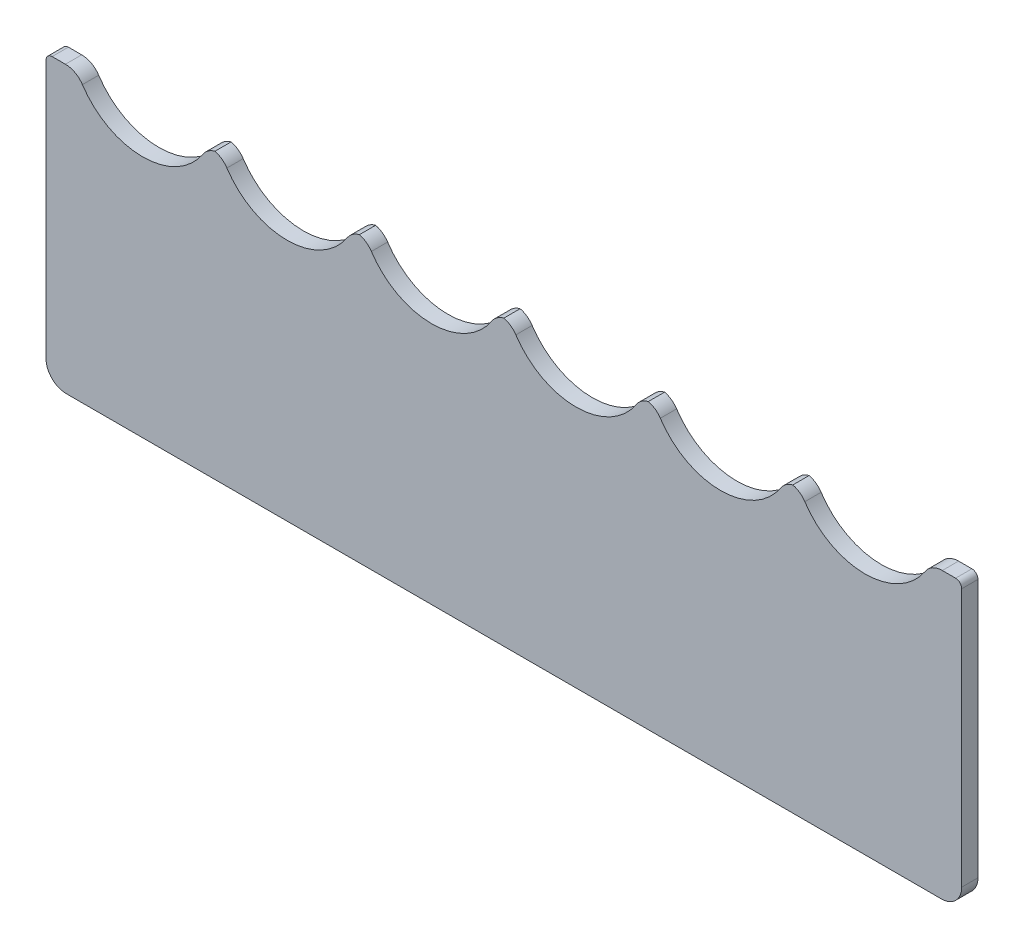
ISO-10303-21;
HEADER;
FILE_DESCRIPTION(('STEP AP214'),'2;1');
FILE_NAME('part.step','',(''),(''),'','','');
FILE_SCHEMA(('AUTOMOTIVE_DESIGN { 1 0 10303 214 1 1 1 1 }'));
ENDSEC;
DATA;
#1=APPLICATION_CONTEXT('core data for automotive mechanical design processes');
#2=APPLICATION_PROTOCOL_DEFINITION('international standard','automotive_design',2000,#1);
#3=PRODUCT_CONTEXT('',#1,'mechanical');
#4=PRODUCT('Part','Part','',(#3));
#5=PRODUCT_RELATED_PRODUCT_CATEGORY('part','',(#4));
#6=PRODUCT_DEFINITION_FORMATION('','',#4);
#7=PRODUCT_DEFINITION_CONTEXT('part definition',#1,'design');
#8=PRODUCT_DEFINITION('design','',#6,#7);
#9=PRODUCT_DEFINITION_SHAPE('','',#8);
#10=(LENGTH_UNIT() NAMED_UNIT(*) SI_UNIT(.MILLI.,.METRE.));
#11=(NAMED_UNIT(*) PLANE_ANGLE_UNIT() SI_UNIT($,.RADIAN.));
#12=(NAMED_UNIT(*) SI_UNIT($,.STERADIAN.) SOLID_ANGLE_UNIT());
#13=UNCERTAINTY_MEASURE_WITH_UNIT(LENGTH_MEASURE(1.E-05),#10,'distance_accuracy_value','');
#14=(GEOMETRIC_REPRESENTATION_CONTEXT(3) GLOBAL_UNCERTAINTY_ASSIGNED_CONTEXT((#13)) GLOBAL_UNIT_ASSIGNED_CONTEXT((#10,
#11,#12)) REPRESENTATION_CONTEXT('',''));
#15=CARTESIAN_POINT('',(0.,0.,0.));
#16=DIRECTION('',(0.,0.,1.));
#17=DIRECTION('',(1.,0.,0.));
#18=AXIS2_PLACEMENT_3D('',#15,#16,#17);
#19=CARTESIAN_POINT('',(0.,140.,8.));
#20=DIRECTION('',(0.,-1.,0.));
#21=DIRECTION('',(0.,0.,-1.));
#22=AXIS2_PLACEMENT_3D('',#19,#20,#21);
#23=PLANE('',#22);
#24=DIRECTION('',(-1.,0.,0.));
#25=VECTOR('',#24,1.);
#26=CARTESIAN_POINT('',(0.,140.,8.));
#27=LINE('',#26,#25);
#28=CARTESIAN_POINT('',(447.,140.,8.));
#29=VERTEX_POINT('',#28);
#30=CARTESIAN_POINT('',(440.456587043621,140.,8.));
#31=VERTEX_POINT('',#30);
#32=EDGE_CURVE('E234',#29,#31,#27,.T.);
#33=ORIENTED_EDGE('',*,*,#32,.F.);
#34=DIRECTION('',(0.,0.,-1.));
#35=VECTOR('',#34,1.);
#36=CARTESIAN_POINT('',(447.,140.,8.));
#37=LINE('',#36,#35);
#38=CARTESIAN_POINT('',(447.,140.,0.));
#39=VERTEX_POINT('',#38);
#40=EDGE_CURVE('E344',#29,#39,#37,.T.);
#41=ORIENTED_EDGE('',*,*,#40,.T.);
#42=DIRECTION('',(-1.,0.,0.));
#43=VECTOR('',#42,1.);
#44=CARTESIAN_POINT('',(0.,140.,0.));
#45=LINE('',#44,#43);
#46=CARTESIAN_POINT('',(440.456587043621,140.,0.));
#47=VERTEX_POINT('',#46);
#48=EDGE_CURVE('E242',#39,#47,#45,.T.);
#49=ORIENTED_EDGE('',*,*,#48,.T.);
#50=DIRECTION('',(0.,0.,1.));
#51=VECTOR('',#50,1.);
#52=CARTESIAN_POINT('',(440.456587043621,140.,8.));
#53=LINE('',#52,#51);
#54=EDGE_CURVE('E316',#47,#31,#53,.T.);
#55=ORIENTED_EDGE('',*,*,#54,.T.);
#56=EDGE_LOOP('',(#33,#41,#49,#55));
#57=FACE_BOUND('',#56,.T.);
#58=ADVANCED_FACE('F33',(#57),#23,.F.);
#59=CARTESIAN_POINT('',(0.,0.,8.));
#60=DIRECTION('',(1.,0.,0.));
#61=DIRECTION('',(0.,0.,-1.));
#62=AXIS2_PLACEMENT_3D('',#59,#60,#61);
#63=PLANE('',#62);
#64=DIRECTION('',(0.,-1.,0.));
#65=VECTOR('',#64,1.);
#66=CARTESIAN_POINT('',(0.,0.,8.));
#67=LINE('',#66,#65);
#68=CARTESIAN_POINT('',(0.,137.,8.));
#69=VERTEX_POINT('',#68);
#70=CARTESIAN_POINT('',(0.,10.,8.));
#71=VERTEX_POINT('',#70);
#72=EDGE_CURVE('E247',#69,#71,#67,.T.);
#73=ORIENTED_EDGE('',*,*,#72,.F.);
#74=DIRECTION('',(0.,0.,-1.));
#75=VECTOR('',#74,1.);
#76=CARTESIAN_POINT('',(0.,137.,8.));
#77=LINE('',#76,#75);
#78=CARTESIAN_POINT('',(0.,137.,0.));
#79=VERTEX_POINT('',#78);
#80=EDGE_CURVE('E41',#69,#79,#77,.T.);
#81=ORIENTED_EDGE('',*,*,#80,.T.);
#82=DIRECTION('',(0.,-1.,0.));
#83=VECTOR('',#82,1.);
#84=CARTESIAN_POINT('',(0.,0.,0.));
#85=LINE('',#84,#83);
#86=CARTESIAN_POINT('',(0.,10.,0.));
#87=VERTEX_POINT('',#86);
#88=EDGE_CURVE('E244',#79,#87,#85,.T.);
#89=ORIENTED_EDGE('',*,*,#88,.T.);
#90=DIRECTION('',(0.,0.,-1.));
#91=VECTOR('',#90,1.);
#92=CARTESIAN_POINT('',(0.,10.,8.));
#93=LINE('',#92,#91);
#94=EDGE_CURVE('E306',#87,#71,#93,.F.);
#95=ORIENTED_EDGE('',*,*,#94,.T.);
#96=EDGE_LOOP('',(#73,#81,#89,#95));
#97=FACE_BOUND('',#96,.T.);
#98=ADVANCED_FACE('F374',(#97),#63,.F.);
#99=CARTESIAN_POINT('',(0.,0.,8.));
#100=DIRECTION('',(0.,1.,0.));
#101=DIRECTION('',(0.,0.,1.));
#102=AXIS2_PLACEMENT_3D('',#99,#100,#101);
#103=PLANE('',#102);
#104=DIRECTION('',(1.,0.,0.));
#105=VECTOR('',#104,1.);
#106=CARTESIAN_POINT('',(0.,0.,0.));
#107=LINE('',#106,#105);
#108=CARTESIAN_POINT('',(10.,0.,0.));
#109=VERTEX_POINT('',#108);
#110=CARTESIAN_POINT('',(440.,0.,0.));
#111=VERTEX_POINT('',#110);
#112=EDGE_CURVE('E240',#109,#111,#107,.T.);
#113=ORIENTED_EDGE('',*,*,#112,.T.);
#114=DIRECTION('',(0.,0.,-1.));
#115=VECTOR('',#114,1.);
#116=CARTESIAN_POINT('',(440.,0.,8.));
#117=LINE('',#116,#115);
#118=CARTESIAN_POINT('',(440.,0.,8.));
#119=VERTEX_POINT('',#118);
#120=EDGE_CURVE('E217',#111,#119,#117,.F.);
#121=ORIENTED_EDGE('',*,*,#120,.T.);
#122=DIRECTION('',(1.,0.,0.));
#123=VECTOR('',#122,1.);
#124=CARTESIAN_POINT('',(0.,0.,8.));
#125=LINE('',#124,#123);
#126=CARTESIAN_POINT('',(10.,0.,8.));
#127=VERTEX_POINT('',#126);
#128=EDGE_CURVE('E386',#127,#119,#125,.T.);
#129=ORIENTED_EDGE('',*,*,#128,.F.);
#130=DIRECTION('',(0.,0.,-1.));
#131=VECTOR('',#130,1.);
#132=CARTESIAN_POINT('',(10.,0.,8.));
#133=LINE('',#132,#131);
#134=EDGE_CURVE('E222',#127,#109,#133,.T.);
#135=ORIENTED_EDGE('',*,*,#134,.T.);
#136=EDGE_LOOP('',(#113,#121,#129,#135));
#137=FACE_BOUND('',#136,.T.);
#138=ADVANCED_FACE('F497',(#137),#103,.F.);
#139=CARTESIAN_POINT('',(450.,0.,8.));
#140=DIRECTION('',(-1.,0.,0.));
#141=DIRECTION('',(0.,0.,1.));
#142=AXIS2_PLACEMENT_3D('',#139,#140,#141);
#143=PLANE('',#142);
#144=DIRECTION('',(0.,1.,0.));
#145=VECTOR('',#144,1.);
#146=CARTESIAN_POINT('',(450.,0.,0.));
#147=LINE('',#146,#145);
#148=CARTESIAN_POINT('',(450.,10.,0.));
#149=VERTEX_POINT('',#148);
#150=CARTESIAN_POINT('',(450.,137.,0.));
#151=VERTEX_POINT('',#150);
#152=EDGE_CURVE('E229',#149,#151,#147,.T.);
#153=ORIENTED_EDGE('',*,*,#152,.T.);
#154=DIRECTION('',(0.,0.,-1.));
#155=VECTOR('',#154,1.);
#156=CARTESIAN_POINT('',(450.,137.,8.));
#157=LINE('',#156,#155);
#158=CARTESIAN_POINT('',(450.,137.,8.));
#159=VERTEX_POINT('',#158);
#160=EDGE_CURVE('E366',#151,#159,#157,.F.);
#161=ORIENTED_EDGE('',*,*,#160,.T.);
#162=DIRECTION('',(0.,1.,0.));
#163=VECTOR('',#162,1.);
#164=CARTESIAN_POINT('',(450.,0.,8.));
#165=LINE('',#164,#163);
#166=CARTESIAN_POINT('',(450.,10.,8.));
#167=VERTEX_POINT('',#166);
#168=EDGE_CURVE('E232',#167,#159,#165,.T.);
#169=ORIENTED_EDGE('',*,*,#168,.F.);
#170=DIRECTION('',(0.,0.,-1.));
#171=VECTOR('',#170,1.);
#172=CARTESIAN_POINT('',(450.,10.,8.));
#173=LINE('',#172,#171);
#174=EDGE_CURVE('E216',#167,#149,#173,.T.);
#175=ORIENTED_EDGE('',*,*,#174,.T.);
#176=EDGE_LOOP('',(#153,#161,#169,#175));
#177=FACE_BOUND('',#176,.T.);
#178=ADVANCED_FACE('F228',(#177),#143,.F.);
#179=CARTESIAN_POINT('',(9.54341295637873,140.,0.));
#180=VERTEX_POINT('',#179);
#181=CARTESIAN_POINT('',(3.,140.,0.));
#182=VERTEX_POINT('',#181);
#183=EDGE_CURVE('E239',#180,#182,#45,.T.);
#184=ORIENTED_EDGE('',*,*,#183,.T.);
#185=DIRECTION('',(0.,0.,-1.));
#186=VECTOR('',#185,1.);
#187=CARTESIAN_POINT('',(3.,140.,8.));
#188=LINE('',#187,#186);
#189=CARTESIAN_POINT('',(3.,140.,8.));
#190=VERTEX_POINT('',#189);
#191=EDGE_CURVE('E11',#182,#190,#188,.F.);
#192=ORIENTED_EDGE('',*,*,#191,.T.);
#193=CARTESIAN_POINT('',(9.54341295637873,140.,8.));
#194=VERTEX_POINT('',#193);
#195=EDGE_CURVE('E384',#194,#190,#27,.T.);
#196=ORIENTED_EDGE('',*,*,#195,.F.);
#197=DIRECTION('',(0.,0.,1.));
#198=VECTOR('',#197,1.);
#199=CARTESIAN_POINT('',(9.54341295637873,140.,8.));
#200=LINE('',#199,#198);
#201=EDGE_CURVE('E309',#194,#180,#200,.F.);
#202=ORIENTED_EDGE('',*,*,#201,.T.);
#203=EDGE_LOOP('',(#184,#192,#196,#202));
#204=FACE_BOUND('',#203,.T.);
#205=ADVANCED_FACE('F513',(#204),#23,.F.);
#206=CARTESIAN_POINT('',(0.,0.,8.));
#207=DIRECTION('',(0.,0.,-1.));
#208=DIRECTION('',(-1.,0.,0.));
#209=AXIS2_PLACEMENT_3D('',#206,#207,#208);
#210=PLANE('',#209);
#211=ORIENTED_EDGE('',*,*,#168,.T.);
#212=CARTESIAN_POINT('',(447.,137.,8.));
#213=DIRECTION('',(0.,0.,-1.));
#214=DIRECTION('',(-1.,0.,0.));
#215=AXIS2_PLACEMENT_3D('',#212,#213,#214);
#216=CIRCLE('',#215,3.);
#217=EDGE_CURVE('E369',#159,#29,#216,.F.);
#218=ORIENTED_EDGE('',*,*,#217,.T.);
#219=ORIENTED_EDGE('',*,*,#32,.T.);
#220=CARTESIAN_POINT('',(440.456587043621,130.,8.));
#221=DIRECTION('',(0.,0.,-1.));
#222=DIRECTION('',(-1.,0.,0.));
#223=AXIS2_PLACEMENT_3D('',#220,#221,#222);
#224=CIRCLE('',#223,10.);
#225=CARTESIAN_POINT('',(432.105302765597,135.500550055006,8.));
#226=VERTEX_POINT('',#225);
#227=EDGE_CURVE('E298',#31,#226,#224,.F.);
#228=ORIENTED_EDGE('',*,*,#227,.T.);
#229=CARTESIAN_POINT('',(402.5,155.,8.));
#230=DIRECTION('',(0.,0.,-1.));
#231=DIRECTION('',(-1.,0.,0.));
#232=AXIS2_PLACEMENT_3D('',#229,#230,#231);
#233=CIRCLE('',#232,35.45);
#234=CARTESIAN_POINT('',(372.894697234403,135.500550055006,8.));
#235=VERTEX_POINT('',#234);
#236=EDGE_CURVE('E398',#226,#235,#233,.T.);
#237=ORIENTED_EDGE('',*,*,#236,.T.);
#238=CARTESIAN_POINT('',(364.543412956379,130.,8.));
#239=DIRECTION('',(0.,0.,-1.));
#240=DIRECTION('',(-1.,0.,0.));
#241=AXIS2_PLACEMENT_3D('',#238,#239,#240);
#242=CIRCLE('',#241,10.);
#243=CARTESIAN_POINT('',(367.,139.693563849128,8.));
#244=VERTEX_POINT('',#243);
#245=EDGE_CURVE('E296',#235,#244,#242,.F.);
#246=ORIENTED_EDGE('',*,*,#245,.T.);
#247=CARTESIAN_POINT('',(369.456587043621,130.,8.));
#248=DIRECTION('',(0.,0.,-1.));
#249=DIRECTION('',(-1.,0.,0.));
#250=AXIS2_PLACEMENT_3D('',#247,#248,#249);
#251=CIRCLE('',#250,10.);
#252=CARTESIAN_POINT('',(361.105302765597,135.500550055006,8.));
#253=VERTEX_POINT('',#252);
#254=EDGE_CURVE('E294',#244,#253,#251,.F.);
#255=ORIENTED_EDGE('',*,*,#254,.T.);
#256=CARTESIAN_POINT('',(331.5,155.,8.));
#257=DIRECTION('',(0.,0.,-1.));
#258=DIRECTION('',(-1.,0.,0.));
#259=AXIS2_PLACEMENT_3D('',#256,#257,#258);
#260=CIRCLE('',#259,35.45);
#261=CARTESIAN_POINT('',(301.894697234403,135.500550055006,8.));
#262=VERTEX_POINT('',#261);
#263=EDGE_CURVE('E401',#253,#262,#260,.T.);
#264=ORIENTED_EDGE('',*,*,#263,.T.);
#265=CARTESIAN_POINT('',(293.543412956379,130.,8.));
#266=DIRECTION('',(0.,0.,-1.));
#267=DIRECTION('',(-1.,0.,0.));
#268=AXIS2_PLACEMENT_3D('',#265,#266,#267);
#269=CIRCLE('',#268,10.);
#270=CARTESIAN_POINT('',(296.,139.693563849128,8.));
#271=VERTEX_POINT('',#270);
#272=EDGE_CURVE('E292',#262,#271,#269,.F.);
#273=ORIENTED_EDGE('',*,*,#272,.T.);
#274=CARTESIAN_POINT('',(298.456587043621,130.,8.));
#275=DIRECTION('',(0.,0.,-1.));
#276=DIRECTION('',(-1.,0.,0.));
#277=AXIS2_PLACEMENT_3D('',#274,#275,#276);
#278=CIRCLE('',#277,10.);
#279=CARTESIAN_POINT('',(290.105302765597,135.500550055006,8.));
#280=VERTEX_POINT('',#279);
#281=EDGE_CURVE('E290',#271,#280,#278,.F.);
#282=ORIENTED_EDGE('',*,*,#281,.T.);
#283=CARTESIAN_POINT('',(260.5,155.,8.));
#284=DIRECTION('',(0.,0.,-1.));
#285=DIRECTION('',(-1.,0.,0.));
#286=AXIS2_PLACEMENT_3D('',#283,#284,#285);
#287=CIRCLE('',#286,35.45);
#288=CARTESIAN_POINT('',(230.894697234403,135.500550055006,8.));
#289=VERTEX_POINT('',#288);
#290=EDGE_CURVE('E404',#280,#289,#287,.T.);
#291=ORIENTED_EDGE('',*,*,#290,.T.);
#292=CARTESIAN_POINT('',(222.543412956379,130.,8.));
#293=DIRECTION('',(0.,0.,-1.));
#294=DIRECTION('',(-1.,0.,0.));
#295=AXIS2_PLACEMENT_3D('',#292,#293,#294);
#296=CIRCLE('',#295,10.);
#297=CARTESIAN_POINT('',(225.,139.693563849128,8.));
#298=VERTEX_POINT('',#297);
#299=EDGE_CURVE('E288',#289,#298,#296,.F.);
#300=ORIENTED_EDGE('',*,*,#299,.T.);
#301=CARTESIAN_POINT('',(227.456587043621,130.,8.));
#302=DIRECTION('',(0.,0.,-1.));
#303=DIRECTION('',(-1.,0.,0.));
#304=AXIS2_PLACEMENT_3D('',#301,#302,#303);
#305=CIRCLE('',#304,10.);
#306=CARTESIAN_POINT('',(219.105302765597,135.500550055006,8.));
#307=VERTEX_POINT('',#306);
#308=EDGE_CURVE('E286',#298,#307,#305,.F.);
#309=ORIENTED_EDGE('',*,*,#308,.T.);
#310=CARTESIAN_POINT('',(189.5,155.,8.));
#311=DIRECTION('',(0.,0.,-1.));
#312=DIRECTION('',(-1.,0.,0.));
#313=AXIS2_PLACEMENT_3D('',#310,#311,#312);
#314=CIRCLE('',#313,35.45);
#315=CARTESIAN_POINT('',(159.894697234403,135.500550055006,8.));
#316=VERTEX_POINT('',#315);
#317=EDGE_CURVE('E378',#307,#316,#314,.T.);
#318=ORIENTED_EDGE('',*,*,#317,.T.);
#319=CARTESIAN_POINT('',(151.543412956379,130.,8.));
#320=DIRECTION('',(0.,0.,-1.));
#321=DIRECTION('',(-1.,0.,0.));
#322=AXIS2_PLACEMENT_3D('',#319,#320,#321);
#323=CIRCLE('',#322,10.);
#324=CARTESIAN_POINT('',(154.,139.693563849128,8.));
#325=VERTEX_POINT('',#324);
#326=EDGE_CURVE('E284',#316,#325,#323,.F.);
#327=ORIENTED_EDGE('',*,*,#326,.T.);
#328=CARTESIAN_POINT('',(156.456587043621,130.,8.));
#329=DIRECTION('',(0.,0.,-1.));
#330=DIRECTION('',(-1.,0.,0.));
#331=AXIS2_PLACEMENT_3D('',#328,#329,#330);
#332=CIRCLE('',#331,10.);
#333=CARTESIAN_POINT('',(148.105302765597,135.500550055006,8.));
#334=VERTEX_POINT('',#333);
#335=EDGE_CURVE('E282',#325,#334,#332,.F.);
#336=ORIENTED_EDGE('',*,*,#335,.T.);
#337=CARTESIAN_POINT('',(118.5,155.,8.));
#338=DIRECTION('',(0.,0.,-1.));
#339=DIRECTION('',(-1.,0.,0.));
#340=AXIS2_PLACEMENT_3D('',#337,#338,#339);
#341=CIRCLE('',#340,35.45);
#342=CARTESIAN_POINT('',(88.8946972344032,135.500550055006,8.));
#343=VERTEX_POINT('',#342);
#344=EDGE_CURVE('E392',#334,#343,#341,.T.);
#345=ORIENTED_EDGE('',*,*,#344,.T.);
#346=CARTESIAN_POINT('',(80.5434129563787,130.,8.));
#347=DIRECTION('',(0.,0.,-1.));
#348=DIRECTION('',(-1.,0.,0.));
#349=AXIS2_PLACEMENT_3D('',#346,#347,#348);
#350=CIRCLE('',#349,10.);
#351=CARTESIAN_POINT('',(83.,139.693563849128,8.));
#352=VERTEX_POINT('',#351);
#353=EDGE_CURVE('E280',#343,#352,#350,.F.);
#354=ORIENTED_EDGE('',*,*,#353,.T.);
#355=CARTESIAN_POINT('',(85.4565870436213,130.,8.));
#356=DIRECTION('',(0.,0.,-1.));
#357=DIRECTION('',(-1.,0.,0.));
#358=AXIS2_PLACEMENT_3D('',#355,#356,#357);
#359=CIRCLE('',#358,10.);
#360=CARTESIAN_POINT('',(77.1053027655968,135.500550055006,8.));
#361=VERTEX_POINT('',#360);
#362=EDGE_CURVE('E278',#352,#361,#359,.F.);
#363=ORIENTED_EDGE('',*,*,#362,.T.);
#364=CARTESIAN_POINT('',(47.5,155.,8.));
#365=DIRECTION('',(0.,0.,-1.));
#366=DIRECTION('',(-1.,0.,0.));
#367=AXIS2_PLACEMENT_3D('',#364,#365,#366);
#368=CIRCLE('',#367,35.45);
#369=CARTESIAN_POINT('',(17.8946972344032,135.500550055006,8.));
#370=VERTEX_POINT('',#369);
#371=EDGE_CURVE('E395',#361,#370,#368,.T.);
#372=ORIENTED_EDGE('',*,*,#371,.T.);
#373=CARTESIAN_POINT('',(9.54341295637873,130.,8.));
#374=DIRECTION('',(0.,0.,-1.));
#375=DIRECTION('',(-1.,0.,0.));
#376=AXIS2_PLACEMENT_3D('',#373,#374,#375);
#377=CIRCLE('',#376,10.);
#378=EDGE_CURVE('E300',#370,#194,#377,.F.);
#379=ORIENTED_EDGE('',*,*,#378,.T.);
#380=ORIENTED_EDGE('',*,*,#195,.T.);
#381=CARTESIAN_POINT('',(3.,137.,8.));
#382=DIRECTION('',(0.,0.,-1.));
#383=DIRECTION('',(-1.,0.,0.));
#384=AXIS2_PLACEMENT_3D('',#381,#382,#383);
#385=CIRCLE('',#384,3.);
#386=EDGE_CURVE('E48',#190,#69,#385,.F.);
#387=ORIENTED_EDGE('',*,*,#386,.T.);
#388=ORIENTED_EDGE('',*,*,#72,.T.);
#389=CARTESIAN_POINT('',(10.,10.,8.));
#390=DIRECTION('',(0.,0.,-1.));
#391=DIRECTION('',(-1.,0.,0.));
#392=AXIS2_PLACEMENT_3D('',#389,#390,#391);
#393=CIRCLE('',#392,10.);
#394=EDGE_CURVE('E302',#71,#127,#393,.F.);
#395=ORIENTED_EDGE('',*,*,#394,.T.);
#396=ORIENTED_EDGE('',*,*,#128,.T.);
#397=CARTESIAN_POINT('',(440.,10.,8.));
#398=DIRECTION('',(0.,0.,-1.));
#399=DIRECTION('',(-1.,0.,0.));
#400=AXIS2_PLACEMENT_3D('',#397,#398,#399);
#401=CIRCLE('',#400,10.);
#402=EDGE_CURVE('E304',#119,#167,#401,.F.);
#403=ORIENTED_EDGE('',*,*,#402,.T.);
#404=EDGE_LOOP('',(#211,#218,#219,#228,#237,#246,#255,#264,#273,#282,#291,#300,#309,#318,#327,
#336,#345,#354,#363,#372,#379,#380,#387,#388,#395,#396,#403));
#405=FACE_BOUND('',#404,.T.);
#406=ADVANCED_FACE('F454',(#405),#210,.F.);
#407=CARTESIAN_POINT('',(0.,0.,0.));
#408=DIRECTION('',(0.,0.,-1.));
#409=DIRECTION('',(-1.,0.,0.));
#410=AXIS2_PLACEMENT_3D('',#407,#408,#409);
#411=PLANE('',#410);
#412=ORIENTED_EDGE('',*,*,#48,.F.);
#413=CARTESIAN_POINT('',(447.,137.,0.));
#414=DIRECTION('',(0.,0.,-1.));
#415=DIRECTION('',(-1.,0.,0.));
#416=AXIS2_PLACEMENT_3D('',#413,#414,#415);
#417=CIRCLE('',#416,3.);
#418=EDGE_CURVE('E238',#39,#151,#417,.T.);
#419=ORIENTED_EDGE('',*,*,#418,.T.);
#420=ORIENTED_EDGE('',*,*,#152,.F.);
#421=CARTESIAN_POINT('',(440.,10.,0.));
#422=DIRECTION('',(0.,0.,-1.));
#423=DIRECTION('',(-1.,0.,0.));
#424=AXIS2_PLACEMENT_3D('',#421,#422,#423);
#425=CIRCLE('',#424,10.);
#426=EDGE_CURVE('E212',#149,#111,#425,.T.);
#427=ORIENTED_EDGE('',*,*,#426,.T.);
#428=ORIENTED_EDGE('',*,*,#112,.F.);
#429=CARTESIAN_POINT('',(10.,10.,0.));
#430=DIRECTION('',(0.,0.,-1.));
#431=DIRECTION('',(-1.,0.,0.));
#432=AXIS2_PLACEMENT_3D('',#429,#430,#431);
#433=CIRCLE('',#432,10.);
#434=EDGE_CURVE('E223',#109,#87,#433,.T.);
#435=ORIENTED_EDGE('',*,*,#434,.T.);
#436=ORIENTED_EDGE('',*,*,#88,.F.);
#437=CARTESIAN_POINT('',(3.,137.,0.));
#438=DIRECTION('',(0.,0.,-1.));
#439=DIRECTION('',(-1.,0.,0.));
#440=AXIS2_PLACEMENT_3D('',#437,#438,#439);
#441=CIRCLE('',#440,3.);
#442=EDGE_CURVE('E363',#79,#182,#441,.T.);
#443=ORIENTED_EDGE('',*,*,#442,.T.);
#444=ORIENTED_EDGE('',*,*,#183,.F.);
#445=CARTESIAN_POINT('',(9.54341295637873,130.,0.));
#446=DIRECTION('',(0.,0.,-1.));
#447=DIRECTION('',(-1.,0.,0.));
#448=AXIS2_PLACEMENT_3D('',#445,#446,#447);
#449=CIRCLE('',#448,10.);
#450=CARTESIAN_POINT('',(17.8946972344032,135.500550055006,0.));
#451=VERTEX_POINT('',#450);
#452=EDGE_CURVE('E271',#180,#451,#449,.T.);
#453=ORIENTED_EDGE('',*,*,#452,.T.);
#454=CARTESIAN_POINT('',(47.5,155.,0.));
#455=DIRECTION('',(0.,0.,1.));
#456=DIRECTION('',(1.,0.,0.));
#457=AXIS2_PLACEMENT_3D('',#454,#455,#456);
#458=CIRCLE('',#457,35.45);
#459=CARTESIAN_POINT('',(77.1053027655968,135.500550055006,0.));
#460=VERTEX_POINT('',#459);
#461=EDGE_CURVE('E416',#451,#460,#458,.T.);
#462=ORIENTED_EDGE('',*,*,#461,.T.);
#463=CARTESIAN_POINT('',(85.4565870436213,130.,0.));
#464=DIRECTION('',(0.,0.,-1.));
#465=DIRECTION('',(-1.,0.,0.));
#466=AXIS2_PLACEMENT_3D('',#463,#464,#465);
#467=CIRCLE('',#466,10.);
#468=CARTESIAN_POINT('',(83.,139.693563849128,0.));
#469=VERTEX_POINT('',#468);
#470=EDGE_CURVE('E233',#460,#469,#467,.T.);
#471=ORIENTED_EDGE('',*,*,#470,.T.);
#472=CARTESIAN_POINT('',(80.5434129563787,130.,0.));
#473=DIRECTION('',(0.,0.,-1.));
#474=DIRECTION('',(-1.,0.,0.));
#475=AXIS2_PLACEMENT_3D('',#472,#473,#474);
#476=CIRCLE('',#475,10.);
#477=CARTESIAN_POINT('',(88.8946972344032,135.500550055006,0.));
#478=VERTEX_POINT('',#477);
#479=EDGE_CURVE('E250',#469,#478,#476,.T.);
#480=ORIENTED_EDGE('',*,*,#479,.T.);
#481=CARTESIAN_POINT('',(118.5,155.,0.));
#482=DIRECTION('',(0.,0.,1.));
#483=DIRECTION('',(1.,0.,0.));
#484=AXIS2_PLACEMENT_3D('',#481,#482,#483);
#485=CIRCLE('',#484,35.45);
#486=CARTESIAN_POINT('',(148.105302765597,135.500550055006,0.));
#487=VERTEX_POINT('',#486);
#488=EDGE_CURVE('E407',#478,#487,#485,.T.);
#489=ORIENTED_EDGE('',*,*,#488,.T.);
#490=CARTESIAN_POINT('',(156.456587043621,130.,0.));
#491=DIRECTION('',(0.,0.,-1.));
#492=DIRECTION('',(-1.,0.,0.));
#493=AXIS2_PLACEMENT_3D('',#490,#491,#492);
#494=CIRCLE('',#493,10.);
#495=CARTESIAN_POINT('',(154.,139.693563849128,0.));
#496=VERTEX_POINT('',#495);
#497=EDGE_CURVE('E252',#487,#496,#494,.T.);
#498=ORIENTED_EDGE('',*,*,#497,.T.);
#499=CARTESIAN_POINT('',(151.543412956379,130.,0.));
#500=DIRECTION('',(0.,0.,-1.));
#501=DIRECTION('',(-1.,0.,0.));
#502=AXIS2_PLACEMENT_3D('',#499,#500,#501);
#503=CIRCLE('',#502,10.);
#504=CARTESIAN_POINT('',(159.894697234403,135.500550055006,0.));
#505=VERTEX_POINT('',#504);
#506=EDGE_CURVE('E254',#496,#505,#503,.T.);
#507=ORIENTED_EDGE('',*,*,#506,.T.);
#508=CARTESIAN_POINT('',(189.5,155.,0.));
#509=DIRECTION('',(0.,0.,1.));
#510=DIRECTION('',(1.,0.,0.));
#511=AXIS2_PLACEMENT_3D('',#508,#509,#510);
#512=CIRCLE('',#511,35.45);
#513=CARTESIAN_POINT('',(219.105302765597,135.500550055006,0.));
#514=VERTEX_POINT('',#513);
#515=EDGE_CURVE('E380',#505,#514,#512,.T.);
#516=ORIENTED_EDGE('',*,*,#515,.T.);
#517=CARTESIAN_POINT('',(227.456587043621,130.,0.));
#518=DIRECTION('',(0.,0.,-1.));
#519=DIRECTION('',(-1.,0.,0.));
#520=AXIS2_PLACEMENT_3D('',#517,#518,#519);
#521=CIRCLE('',#520,10.);
#522=CARTESIAN_POINT('',(225.,139.693563849128,0.));
#523=VERTEX_POINT('',#522);
#524=EDGE_CURVE('E256',#514,#523,#521,.T.);
#525=ORIENTED_EDGE('',*,*,#524,.T.);
#526=CARTESIAN_POINT('',(222.543412956379,130.,0.));
#527=DIRECTION('',(0.,0.,-1.));
#528=DIRECTION('',(-1.,0.,0.));
#529=AXIS2_PLACEMENT_3D('',#526,#527,#528);
#530=CIRCLE('',#529,10.);
#531=CARTESIAN_POINT('',(230.894697234403,135.500550055006,0.));
#532=VERTEX_POINT('',#531);
#533=EDGE_CURVE('E258',#523,#532,#530,.T.);
#534=ORIENTED_EDGE('',*,*,#533,.T.);
#535=CARTESIAN_POINT('',(260.5,155.,0.));
#536=DIRECTION('',(0.,0.,1.));
#537=DIRECTION('',(-1.,0.,0.));
#538=AXIS2_PLACEMENT_3D('',#535,#536,#537);
#539=CIRCLE('',#538,35.45);
#540=CARTESIAN_POINT('',(290.105302765597,135.500550055006,0.));
#541=VERTEX_POINT('',#540);
#542=EDGE_CURVE('E348',#532,#541,#539,.T.);
#543=ORIENTED_EDGE('',*,*,#542,.T.);
#544=CARTESIAN_POINT('',(298.456587043621,130.,0.));
#545=DIRECTION('',(0.,0.,-1.));
#546=DIRECTION('',(-1.,0.,0.));
#547=AXIS2_PLACEMENT_3D('',#544,#545,#546);
#548=CIRCLE('',#547,10.);
#549=CARTESIAN_POINT('',(296.,139.693563849128,0.));
#550=VERTEX_POINT('',#549);
#551=EDGE_CURVE('E260',#541,#550,#548,.T.);
#552=ORIENTED_EDGE('',*,*,#551,.T.);
#553=CARTESIAN_POINT('',(293.543412956379,130.,0.));
#554=DIRECTION('',(0.,0.,-1.));
#555=DIRECTION('',(-1.,0.,0.));
#556=AXIS2_PLACEMENT_3D('',#553,#554,#555);
#557=CIRCLE('',#556,10.);
#558=CARTESIAN_POINT('',(301.894697234403,135.500550055006,0.));
#559=VERTEX_POINT('',#558);
#560=EDGE_CURVE('E262',#550,#559,#557,.T.);
#561=ORIENTED_EDGE('',*,*,#560,.T.);
#562=CARTESIAN_POINT('',(331.5,155.,0.));
#563=DIRECTION('',(0.,0.,1.));
#564=DIRECTION('',(-1.,0.,0.));
#565=AXIS2_PLACEMENT_3D('',#562,#563,#564);
#566=CIRCLE('',#565,35.45);
#567=CARTESIAN_POINT('',(361.105302765597,135.500550055006,0.));
#568=VERTEX_POINT('',#567);
#569=EDGE_CURVE('E410',#559,#568,#566,.T.);
#570=ORIENTED_EDGE('',*,*,#569,.T.);
#571=CARTESIAN_POINT('',(369.456587043621,130.,0.));
#572=DIRECTION('',(0.,0.,-1.));
#573=DIRECTION('',(-1.,0.,0.));
#574=AXIS2_PLACEMENT_3D('',#571,#572,#573);
#575=CIRCLE('',#574,10.);
#576=CARTESIAN_POINT('',(367.,139.693563849128,0.));
#577=VERTEX_POINT('',#576);
#578=EDGE_CURVE('E264',#568,#577,#575,.T.);
#579=ORIENTED_EDGE('',*,*,#578,.T.);
#580=CARTESIAN_POINT('',(364.543412956379,130.,0.));
#581=DIRECTION('',(0.,0.,-1.));
#582=DIRECTION('',(-1.,0.,0.));
#583=AXIS2_PLACEMENT_3D('',#580,#581,#582);
#584=CIRCLE('',#583,10.);
#585=CARTESIAN_POINT('',(372.894697234403,135.500550055006,0.));
#586=VERTEX_POINT('',#585);
#587=EDGE_CURVE('E266',#577,#586,#584,.T.);
#588=ORIENTED_EDGE('',*,*,#587,.T.);
#589=CARTESIAN_POINT('',(402.5,155.,0.));
#590=DIRECTION('',(0.,0.,1.));
#591=DIRECTION('',(-1.,0.,0.));
#592=AXIS2_PLACEMENT_3D('',#589,#590,#591);
#593=CIRCLE('',#592,35.45);
#594=CARTESIAN_POINT('',(432.105302765597,135.500550055006,0.));
#595=VERTEX_POINT('',#594);
#596=EDGE_CURVE('E413',#586,#595,#593,.T.);
#597=ORIENTED_EDGE('',*,*,#596,.T.);
#598=CARTESIAN_POINT('',(440.456587043621,130.,0.));
#599=DIRECTION('',(0.,0.,-1.));
#600=DIRECTION('',(-1.,0.,0.));
#601=AXIS2_PLACEMENT_3D('',#598,#599,#600);
#602=CIRCLE('',#601,10.);
#603=EDGE_CURVE('E268',#595,#47,#602,.T.);
#604=ORIENTED_EDGE('',*,*,#603,.T.);
#605=EDGE_LOOP('',(#412,#419,#420,#427,#428,#435,#436,#443,#444,#453,#462,#471,#480,#489,#498,
#507,#516,#525,#534,#543,#552,#561,#570,#579,#588,#597,#604));
#606=FACE_BOUND('',#605,.T.);
#607=ADVANCED_FACE('F237',(#606),#411,.T.);
#608=CARTESIAN_POINT('',(189.5,155.,0.));
#609=DIRECTION('',(0.,0.,1.));
#610=DIRECTION('',(1.,0.,0.));
#611=AXIS2_PLACEMENT_3D('',#608,#609,#610);
#612=CYLINDRICAL_SURFACE('',#611,35.45);
#613=ORIENTED_EDGE('',*,*,#317,.F.);
#614=DIRECTION('',(0.,0.,1.));
#615=VECTOR('',#614,1.);
#616=CARTESIAN_POINT('',(219.105302765597,135.500550055006,0.));
#617=LINE('',#616,#615);
#618=EDGE_CURVE('E337',#307,#514,#617,.F.);
#619=ORIENTED_EDGE('',*,*,#618,.T.);
#620=ORIENTED_EDGE('',*,*,#515,.F.);
#621=DIRECTION('',(0.,0.,1.));
#622=VECTOR('',#621,1.);
#623=CARTESIAN_POINT('',(159.894697234403,135.500550055006,0.));
#624=LINE('',#623,#622);
#625=EDGE_CURVE('E334',#505,#316,#624,.T.);
#626=ORIENTED_EDGE('',*,*,#625,.T.);
#627=EDGE_LOOP('',(#613,#619,#620,#626));
#628=FACE_BOUND('',#627,.T.);
#629=ADVANCED_FACE('F438',(#628),#612,.F.);
#630=CARTESIAN_POINT('',(260.5,155.,0.));
#631=DIRECTION('',(0.,0.,1.));
#632=DIRECTION('',(1.,0.,0.));
#633=AXIS2_PLACEMENT_3D('',#630,#631,#632);
#634=CYLINDRICAL_SURFACE('',#633,35.45);
#635=ORIENTED_EDGE('',*,*,#290,.F.);
#636=DIRECTION('',(0.,0.,1.));
#637=VECTOR('',#636,1.);
#638=CARTESIAN_POINT('',(290.105302765597,135.500550055006,0.));
#639=LINE('',#638,#637);
#640=EDGE_CURVE('E332',#280,#541,#639,.F.);
#641=ORIENTED_EDGE('',*,*,#640,.T.);
#642=ORIENTED_EDGE('',*,*,#542,.F.);
#643=DIRECTION('',(0.,0.,1.));
#644=VECTOR('',#643,1.);
#645=CARTESIAN_POINT('',(230.894697234403,135.500550055006,0.));
#646=LINE('',#645,#644);
#647=EDGE_CURVE('E329',#532,#289,#646,.T.);
#648=ORIENTED_EDGE('',*,*,#647,.T.);
#649=EDGE_LOOP('',(#635,#641,#642,#648));
#650=FACE_BOUND('',#649,.T.);
#651=ADVANCED_FACE('F451',(#650),#634,.F.);
#652=CARTESIAN_POINT('',(331.5,155.,0.));
#653=DIRECTION('',(0.,0.,1.));
#654=DIRECTION('',(1.,0.,0.));
#655=AXIS2_PLACEMENT_3D('',#652,#653,#654);
#656=CYLINDRICAL_SURFACE('',#655,35.45);
#657=ORIENTED_EDGE('',*,*,#263,.F.);
#658=DIRECTION('',(0.,0.,1.));
#659=VECTOR('',#658,1.);
#660=CARTESIAN_POINT('',(361.105302765597,135.500550055006,0.));
#661=LINE('',#660,#659);
#662=EDGE_CURVE('E327',#253,#568,#661,.F.);
#663=ORIENTED_EDGE('',*,*,#662,.T.);
#664=ORIENTED_EDGE('',*,*,#569,.F.);
#665=DIRECTION('',(0.,0.,1.));
#666=VECTOR('',#665,1.);
#667=CARTESIAN_POINT('',(301.894697234403,135.500550055006,0.));
#668=LINE('',#667,#666);
#669=EDGE_CURVE('E324',#559,#262,#668,.T.);
#670=ORIENTED_EDGE('',*,*,#669,.T.);
#671=EDGE_LOOP('',(#657,#663,#664,#670));
#672=FACE_BOUND('',#671,.T.);
#673=ADVANCED_FACE('F466',(#672),#656,.F.);
#674=CARTESIAN_POINT('',(402.5,155.,0.));
#675=DIRECTION('',(0.,0.,1.));
#676=DIRECTION('',(1.,0.,0.));
#677=AXIS2_PLACEMENT_3D('',#674,#675,#676);
#678=CYLINDRICAL_SURFACE('',#677,35.45);
#679=ORIENTED_EDGE('',*,*,#236,.F.);
#680=DIRECTION('',(0.,0.,1.));
#681=VECTOR('',#680,1.);
#682=CARTESIAN_POINT('',(432.105302765597,135.500550055006,0.));
#683=LINE('',#682,#681);
#684=EDGE_CURVE('E322',#226,#595,#683,.F.);
#685=ORIENTED_EDGE('',*,*,#684,.T.);
#686=ORIENTED_EDGE('',*,*,#596,.F.);
#687=DIRECTION('',(0.,0.,1.));
#688=VECTOR('',#687,1.);
#689=CARTESIAN_POINT('',(372.894697234403,135.500550055006,0.));
#690=LINE('',#689,#688);
#691=EDGE_CURVE('E319',#586,#235,#690,.T.);
#692=ORIENTED_EDGE('',*,*,#691,.T.);
#693=EDGE_LOOP('',(#679,#685,#686,#692));
#694=FACE_BOUND('',#693,.T.);
#695=ADVANCED_FACE('F480',(#694),#678,.F.);
#696=CARTESIAN_POINT('',(47.5,155.,0.));
#697=DIRECTION('',(0.,0.,1.));
#698=DIRECTION('',(1.,0.,0.));
#699=AXIS2_PLACEMENT_3D('',#696,#697,#698);
#700=CYLINDRICAL_SURFACE('',#699,35.45);
#701=ORIENTED_EDGE('',*,*,#461,.F.);
#702=DIRECTION('',(0.,0.,1.));
#703=VECTOR('',#702,1.);
#704=CARTESIAN_POINT('',(17.8946972344032,135.500550055006,0.));
#705=LINE('',#704,#703);
#706=EDGE_CURVE('E314',#451,#370,#705,.T.);
#707=ORIENTED_EDGE('',*,*,#706,.T.);
#708=ORIENTED_EDGE('',*,*,#371,.F.);
#709=DIRECTION('',(0.,0.,1.));
#710=VECTOR('',#709,1.);
#711=CARTESIAN_POINT('',(77.1053027655968,135.500550055006,0.));
#712=LINE('',#711,#710);
#713=EDGE_CURVE('E312',#361,#460,#712,.F.);
#714=ORIENTED_EDGE('',*,*,#713,.T.);
#715=EDGE_LOOP('',(#701,#707,#708,#714));
#716=FACE_BOUND('',#715,.T.);
#717=ADVANCED_FACE('F673',(#716),#700,.F.);
#718=CARTESIAN_POINT('',(118.5,155.,0.));
#719=DIRECTION('',(0.,0.,1.));
#720=DIRECTION('',(1.,0.,0.));
#721=AXIS2_PLACEMENT_3D('',#718,#719,#720);
#722=CYLINDRICAL_SURFACE('',#721,35.45);
#723=ORIENTED_EDGE('',*,*,#344,.F.);
#724=DIRECTION('',(0.,0.,1.));
#725=VECTOR('',#724,1.);
#726=CARTESIAN_POINT('',(148.105302765597,135.500550055006,0.));
#727=LINE('',#726,#725);
#728=EDGE_CURVE('E342',#334,#487,#727,.F.);
#729=ORIENTED_EDGE('',*,*,#728,.T.);
#730=ORIENTED_EDGE('',*,*,#488,.F.);
#731=DIRECTION('',(0.,0.,1.));
#732=VECTOR('',#731,1.);
#733=CARTESIAN_POINT('',(88.8946972344032,135.500550055006,0.));
#734=LINE('',#733,#732);
#735=EDGE_CURVE('E339',#478,#343,#734,.T.);
#736=ORIENTED_EDGE('',*,*,#735,.T.);
#737=EDGE_LOOP('',(#723,#729,#730,#736));
#738=FACE_BOUND('',#737,.T.);
#739=ADVANCED_FACE('F509',(#738),#722,.F.);
#740=CARTESIAN_POINT('',(440.,10.,8.));
#741=DIRECTION('',(0.,0.,-1.));
#742=DIRECTION('',(-1.,0.,0.));
#743=AXIS2_PLACEMENT_3D('',#740,#741,#742);
#744=CYLINDRICAL_SURFACE('',#743,10.);
#745=ORIENTED_EDGE('',*,*,#402,.F.);
#746=ORIENTED_EDGE('',*,*,#120,.F.);
#747=ORIENTED_EDGE('',*,*,#426,.F.);
#748=ORIENTED_EDGE('',*,*,#174,.F.);
#749=EDGE_LOOP('',(#745,#746,#747,#748));
#750=FACE_BOUND('',#749,.T.);
#751=ADVANCED_FACE('F215',(#750),#744,.T.);
#752=CARTESIAN_POINT('',(10.,10.,8.));
#753=DIRECTION('',(0.,0.,-1.));
#754=DIRECTION('',(-1.,0.,0.));
#755=AXIS2_PLACEMENT_3D('',#752,#753,#754);
#756=CYLINDRICAL_SURFACE('',#755,10.);
#757=ORIENTED_EDGE('',*,*,#394,.F.);
#758=ORIENTED_EDGE('',*,*,#94,.F.);
#759=ORIENTED_EDGE('',*,*,#434,.F.);
#760=ORIENTED_EDGE('',*,*,#134,.F.);
#761=EDGE_LOOP('',(#757,#758,#759,#760));
#762=FACE_BOUND('',#761,.T.);
#763=ADVANCED_FACE('F499',(#762),#756,.T.);
#764=CARTESIAN_POINT('',(9.54341295637873,130.,0.));
#765=DIRECTION('',(0.,0.,1.));
#766=DIRECTION('',(1.,0.,0.));
#767=AXIS2_PLACEMENT_3D('',#764,#765,#766);
#768=CYLINDRICAL_SURFACE('',#767,10.);
#769=ORIENTED_EDGE('',*,*,#378,.F.);
#770=ORIENTED_EDGE('',*,*,#706,.F.);
#771=ORIENTED_EDGE('',*,*,#452,.F.);
#772=ORIENTED_EDGE('',*,*,#201,.F.);
#773=EDGE_LOOP('',(#769,#770,#771,#772));
#774=FACE_BOUND('',#773,.T.);
#775=ADVANCED_FACE('F501',(#774),#768,.T.);
#776=CARTESIAN_POINT('',(440.456587043621,130.,0.));
#777=DIRECTION('',(0.,0.,1.));
#778=DIRECTION('',(1.,0.,0.));
#779=AXIS2_PLACEMENT_3D('',#776,#777,#778);
#780=CYLINDRICAL_SURFACE('',#779,10.);
#781=ORIENTED_EDGE('',*,*,#603,.F.);
#782=ORIENTED_EDGE('',*,*,#684,.F.);
#783=ORIENTED_EDGE('',*,*,#227,.F.);
#784=ORIENTED_EDGE('',*,*,#54,.F.);
#785=EDGE_LOOP('',(#781,#782,#783,#784));
#786=FACE_BOUND('',#785,.T.);
#787=ADVANCED_FACE('F485',(#786),#780,.T.);
#788=CARTESIAN_POINT('',(369.456587043621,130.,0.));
#789=DIRECTION('',(0.,0.,1.));
#790=DIRECTION('',(1.,0.,0.));
#791=AXIS2_PLACEMENT_3D('',#788,#789,#790);
#792=CYLINDRICAL_SURFACE('',#791,10.);
#793=ORIENTED_EDGE('',*,*,#662,.F.);
#794=ORIENTED_EDGE('',*,*,#254,.F.);
#795=DIRECTION('',(0.,0.,1.));
#796=VECTOR('',#795,1.);
#797=CARTESIAN_POINT('',(367.,139.693563849128,4.));
#798=LINE('',#797,#796);
#799=EDGE_CURVE('E345',#577,#244,#798,.T.);
#800=ORIENTED_EDGE('',*,*,#799,.F.);
#801=ORIENTED_EDGE('',*,*,#578,.F.);
#802=EDGE_LOOP('',(#793,#794,#800,#801));
#803=FACE_BOUND('',#802,.T.);
#804=ADVANCED_FACE('F471',(#803),#792,.T.);
#805=CARTESIAN_POINT('',(364.543412956379,130.,0.));
#806=DIRECTION('',(0.,0.,1.));
#807=DIRECTION('',(1.,0.,0.));
#808=AXIS2_PLACEMENT_3D('',#805,#806,#807);
#809=CYLINDRICAL_SURFACE('',#808,10.);
#810=ORIENTED_EDGE('',*,*,#245,.F.);
#811=ORIENTED_EDGE('',*,*,#691,.F.);
#812=ORIENTED_EDGE('',*,*,#587,.F.);
#813=ORIENTED_EDGE('',*,*,#799,.T.);
#814=EDGE_LOOP('',(#810,#811,#812,#813));
#815=FACE_BOUND('',#814,.T.);
#816=ADVANCED_FACE('F482',(#815),#809,.T.);
#817=CARTESIAN_POINT('',(298.456587043621,130.,0.));
#818=DIRECTION('',(0.,0.,1.));
#819=DIRECTION('',(1.,0.,0.));
#820=AXIS2_PLACEMENT_3D('',#817,#818,#819);
#821=CYLINDRICAL_SURFACE('',#820,10.);
#822=ORIENTED_EDGE('',*,*,#640,.F.);
#823=ORIENTED_EDGE('',*,*,#281,.F.);
#824=DIRECTION('',(0.,0.,1.));
#825=VECTOR('',#824,1.);
#826=CARTESIAN_POINT('',(296.,139.693563849128,4.));
#827=LINE('',#826,#825);
#828=EDGE_CURVE('E349',#550,#271,#827,.T.);
#829=ORIENTED_EDGE('',*,*,#828,.F.);
#830=ORIENTED_EDGE('',*,*,#551,.F.);
#831=EDGE_LOOP('',(#822,#823,#829,#830));
#832=FACE_BOUND('',#831,.T.);
#833=ADVANCED_FACE('F457',(#832),#821,.T.);
#834=CARTESIAN_POINT('',(293.543412956379,130.,0.));
#835=DIRECTION('',(0.,0.,1.));
#836=DIRECTION('',(1.,0.,0.));
#837=AXIS2_PLACEMENT_3D('',#834,#835,#836);
#838=CYLINDRICAL_SURFACE('',#837,10.);
#839=ORIENTED_EDGE('',*,*,#272,.F.);
#840=ORIENTED_EDGE('',*,*,#669,.F.);
#841=ORIENTED_EDGE('',*,*,#560,.F.);
#842=ORIENTED_EDGE('',*,*,#828,.T.);
#843=EDGE_LOOP('',(#839,#840,#841,#842));
#844=FACE_BOUND('',#843,.T.);
#845=ADVANCED_FACE('F468',(#844),#838,.T.);
#846=CARTESIAN_POINT('',(227.456587043621,130.,0.));
#847=DIRECTION('',(0.,0.,1.));
#848=DIRECTION('',(1.,0.,0.));
#849=AXIS2_PLACEMENT_3D('',#846,#847,#848);
#850=CYLINDRICAL_SURFACE('',#849,10.);
#851=ORIENTED_EDGE('',*,*,#618,.F.);
#852=ORIENTED_EDGE('',*,*,#308,.F.);
#853=DIRECTION('',(0.,0.,1.));
#854=VECTOR('',#853,1.);
#855=CARTESIAN_POINT('',(225.,139.693563849128,4.));
#856=LINE('',#855,#854);
#857=EDGE_CURVE('E352',#523,#298,#856,.T.);
#858=ORIENTED_EDGE('',*,*,#857,.F.);
#859=ORIENTED_EDGE('',*,*,#524,.F.);
#860=EDGE_LOOP('',(#851,#852,#858,#859));
#861=FACE_BOUND('',#860,.T.);
#862=ADVANCED_FACE('F442',(#861),#850,.T.);
#863=CARTESIAN_POINT('',(222.543412956379,130.,0.));
#864=DIRECTION('',(0.,0.,1.));
#865=DIRECTION('',(1.,0.,0.));
#866=AXIS2_PLACEMENT_3D('',#863,#864,#865);
#867=CYLINDRICAL_SURFACE('',#866,10.);
#868=ORIENTED_EDGE('',*,*,#299,.F.);
#869=ORIENTED_EDGE('',*,*,#647,.F.);
#870=ORIENTED_EDGE('',*,*,#533,.F.);
#871=ORIENTED_EDGE('',*,*,#857,.T.);
#872=EDGE_LOOP('',(#868,#869,#870,#871));
#873=FACE_BOUND('',#872,.T.);
#874=ADVANCED_FACE('F453',(#873),#867,.T.);
#875=CARTESIAN_POINT('',(156.456587043621,130.,0.));
#876=DIRECTION('',(0.,0.,1.));
#877=DIRECTION('',(1.,0.,0.));
#878=AXIS2_PLACEMENT_3D('',#875,#876,#877);
#879=CYLINDRICAL_SURFACE('',#878,10.);
#880=ORIENTED_EDGE('',*,*,#728,.F.);
#881=ORIENTED_EDGE('',*,*,#335,.F.);
#882=DIRECTION('',(0.,0.,1.));
#883=VECTOR('',#882,1.);
#884=CARTESIAN_POINT('',(154.,139.693563849128,4.));
#885=LINE('',#884,#883);
#886=EDGE_CURVE('E355',#496,#325,#885,.T.);
#887=ORIENTED_EDGE('',*,*,#886,.F.);
#888=ORIENTED_EDGE('',*,*,#497,.F.);
#889=EDGE_LOOP('',(#880,#881,#887,#888));
#890=FACE_BOUND('',#889,.T.);
#891=ADVANCED_FACE('F428',(#890),#879,.T.);
#892=CARTESIAN_POINT('',(151.543412956379,130.,0.));
#893=DIRECTION('',(0.,0.,1.));
#894=DIRECTION('',(1.,0.,0.));
#895=AXIS2_PLACEMENT_3D('',#892,#893,#894);
#896=CYLINDRICAL_SURFACE('',#895,10.);
#897=ORIENTED_EDGE('',*,*,#326,.F.);
#898=ORIENTED_EDGE('',*,*,#625,.F.);
#899=ORIENTED_EDGE('',*,*,#506,.F.);
#900=ORIENTED_EDGE('',*,*,#886,.T.);
#901=EDGE_LOOP('',(#897,#898,#899,#900));
#902=FACE_BOUND('',#901,.T.);
#903=ADVANCED_FACE('F433',(#902),#896,.T.);
#904=CARTESIAN_POINT('',(85.4565870436213,130.,0.));
#905=DIRECTION('',(0.,0.,1.));
#906=DIRECTION('',(1.,0.,0.));
#907=AXIS2_PLACEMENT_3D('',#904,#905,#906);
#908=CYLINDRICAL_SURFACE('',#907,10.);
#909=ORIENTED_EDGE('',*,*,#713,.F.);
#910=ORIENTED_EDGE('',*,*,#362,.F.);
#911=DIRECTION('',(0.,0.,1.));
#912=VECTOR('',#911,1.);
#913=CARTESIAN_POINT('',(83.,139.693563849128,4.));
#914=LINE('',#913,#912);
#915=EDGE_CURVE('E358',#469,#352,#914,.T.);
#916=ORIENTED_EDGE('',*,*,#915,.F.);
#917=ORIENTED_EDGE('',*,*,#470,.F.);
#918=EDGE_LOOP('',(#909,#910,#916,#917));
#919=FACE_BOUND('',#918,.T.);
#920=ADVANCED_FACE('F535',(#919),#908,.T.);
#921=CARTESIAN_POINT('',(80.5434129563787,130.,0.));
#922=DIRECTION('',(0.,0.,1.));
#923=DIRECTION('',(1.,0.,0.));
#924=AXIS2_PLACEMENT_3D('',#921,#922,#923);
#925=CYLINDRICAL_SURFACE('',#924,10.);
#926=ORIENTED_EDGE('',*,*,#353,.F.);
#927=ORIENTED_EDGE('',*,*,#735,.F.);
#928=ORIENTED_EDGE('',*,*,#479,.F.);
#929=ORIENTED_EDGE('',*,*,#915,.T.);
#930=EDGE_LOOP('',(#926,#927,#928,#929));
#931=FACE_BOUND('',#930,.T.);
#932=ADVANCED_FACE('F531',(#931),#925,.T.);
#933=CARTESIAN_POINT('',(447.,137.,8.));
#934=DIRECTION('',(0.,0.,-1.));
#935=DIRECTION('',(-1.,0.,0.));
#936=AXIS2_PLACEMENT_3D('',#933,#934,#935);
#937=CYLINDRICAL_SURFACE('',#936,3.);
#938=ORIENTED_EDGE('',*,*,#217,.F.);
#939=ORIENTED_EDGE('',*,*,#160,.F.);
#940=ORIENTED_EDGE('',*,*,#418,.F.);
#941=ORIENTED_EDGE('',*,*,#40,.F.);
#942=EDGE_LOOP('',(#938,#939,#940,#941));
#943=FACE_BOUND('',#942,.T.);
#944=ADVANCED_FACE('F492',(#943),#937,.T.);
#945=CARTESIAN_POINT('',(3.,137.,8.));
#946=DIRECTION('',(0.,0.,-1.));
#947=DIRECTION('',(-1.,0.,0.));
#948=AXIS2_PLACEMENT_3D('',#945,#946,#947);
#949=CYLINDRICAL_SURFACE('',#948,3.);
#950=ORIENTED_EDGE('',*,*,#386,.F.);
#951=ORIENTED_EDGE('',*,*,#191,.F.);
#952=ORIENTED_EDGE('',*,*,#442,.F.);
#953=ORIENTED_EDGE('',*,*,#80,.F.);
#954=EDGE_LOOP('',(#950,#951,#952,#953));
#955=FACE_BOUND('',#954,.T.);
#956=ADVANCED_FACE('F35',(#955),#949,.T.);
#957=CLOSED_SHELL('',(#58,#98,#138,#178,#205,#406,#607,#629,#651,#673,#695,#717,#739,#751,#763,
#775,#787,#804,#816,#833,#845,#862,#874,#891,#903,#920,#932,#944,#956));
#958=MANIFOLD_SOLID_BREP('B2',#957);
#959=ADVANCED_BREP_SHAPE_REPRESENTATION('',(#18,#958),#14);
#960=SHAPE_DEFINITION_REPRESENTATION(#9,#959);
ENDSEC;
END-ISO-10303-21;
